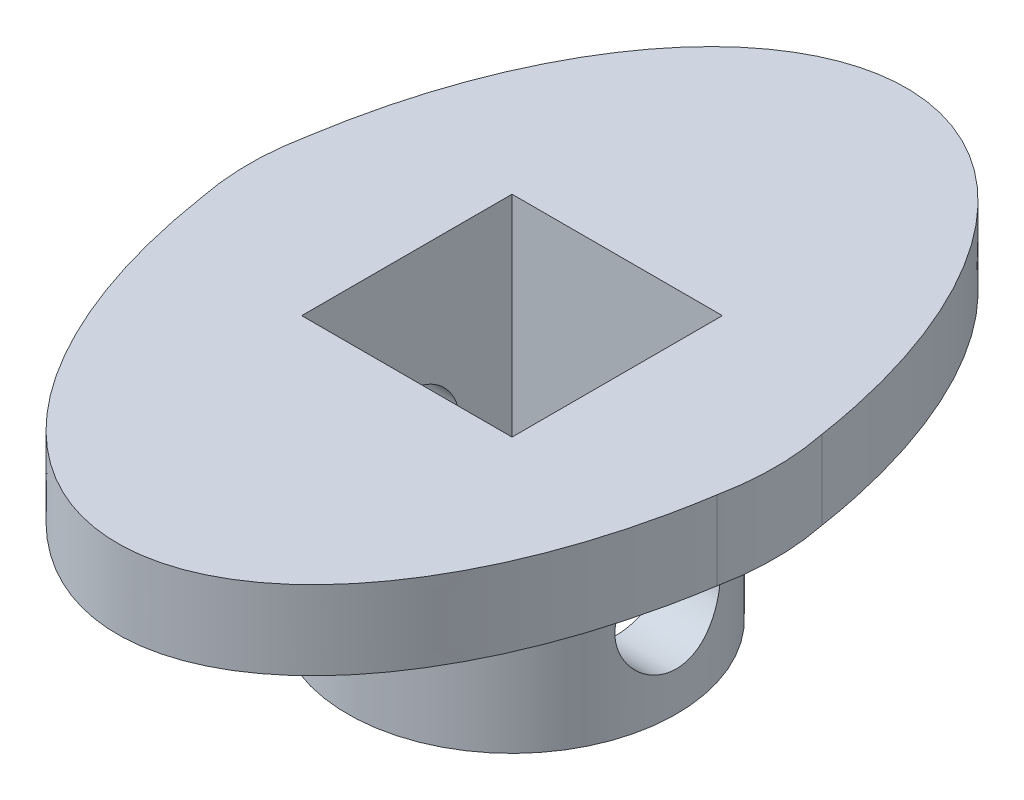
ISO-10303-21;
HEADER;
FILE_DESCRIPTION(('STEP AP214'),'2;1');
FILE_NAME('part.step','',(''),(''),'','','');
FILE_SCHEMA(('AUTOMOTIVE_DESIGN { 1 0 10303 214 1 1 1 1 }'));
ENDSEC;
DATA;
#1=APPLICATION_CONTEXT('core data for automotive mechanical design processes');
#2=APPLICATION_PROTOCOL_DEFINITION('international standard','automotive_design',2000,#1);
#3=PRODUCT_CONTEXT('',#1,'mechanical');
#4=PRODUCT('Part','Part','',(#3));
#5=PRODUCT_RELATED_PRODUCT_CATEGORY('part','',(#4));
#6=PRODUCT_DEFINITION_FORMATION('','',#4);
#7=PRODUCT_DEFINITION_CONTEXT('part definition',#1,'design');
#8=PRODUCT_DEFINITION('design','',#6,#7);
#9=PRODUCT_DEFINITION_SHAPE('','',#8);
#10=(LENGTH_UNIT() NAMED_UNIT(*) SI_UNIT(.MILLI.,.METRE.));
#11=(NAMED_UNIT(*) PLANE_ANGLE_UNIT() SI_UNIT($,.RADIAN.));
#12=(NAMED_UNIT(*) SI_UNIT($,.STERADIAN.) SOLID_ANGLE_UNIT());
#13=UNCERTAINTY_MEASURE_WITH_UNIT(LENGTH_MEASURE(1.E-05),#10,'distance_accuracy_value','');
#14=(GEOMETRIC_REPRESENTATION_CONTEXT(3) GLOBAL_UNCERTAINTY_ASSIGNED_CONTEXT((#13)) GLOBAL_UNIT_ASSIGNED_CONTEXT((#10,
#11,#12)) REPRESENTATION_CONTEXT('',''));
#15=CARTESIAN_POINT('',(0.,0.,0.));
#16=DIRECTION('',(0.,0.,1.));
#17=DIRECTION('',(1.,0.,0.));
#18=AXIS2_PLACEMENT_3D('',#15,#16,#17);
#19=CARTESIAN_POINT('',(0.,3.81,0.));
#20=DIRECTION('',(0.,-1.,0.));
#21=DIRECTION('',(0.,0.,-1.));
#22=AXIS2_PLACEMENT_3D('',#19,#20,#21);
#23=CYLINDRICAL_SURFACE('',#22,12.7);
#24=CARTESIAN_POINT('',(0.,0.,0.));
#25=DIRECTION('',(0.,1.,0.));
#26=DIRECTION('',(0.,0.,1.));
#27=AXIS2_PLACEMENT_3D('',#24,#25,#26);
#28=CIRCLE('',#27,12.7);
#29=CARTESIAN_POINT('',(12.4434078933385,0.,2.54));
#30=VERTEX_POINT('',#29);
#31=CARTESIAN_POINT('',(12.4434078933385,0.,-2.54));
#32=VERTEX_POINT('',#31);
#33=EDGE_CURVE('E150',#30,#32,#28,.T.);
#34=ORIENTED_EDGE('',*,*,#33,.T.);
#35=DIRECTION('',(0.,-1.,0.));
#36=VECTOR('',#35,1.);
#37=CARTESIAN_POINT('',(12.4434078933385,3.81,-2.54));
#38=LINE('',#37,#36);
#39=CARTESIAN_POINT('',(12.4434078933385,3.81,-2.54));
#40=VERTEX_POINT('',#39);
#41=EDGE_CURVE('E47',#40,#32,#38,.T.);
#42=ORIENTED_EDGE('',*,*,#41,.F.);
#43=CARTESIAN_POINT('',(0.,3.81,0.));
#44=DIRECTION('',(0.,1.,0.));
#45=DIRECTION('',(0.,0.,1.));
#46=AXIS2_PLACEMENT_3D('',#43,#44,#45);
#47=CIRCLE('',#46,12.7);
#48=CARTESIAN_POINT('',(12.4434078933385,3.81,2.54));
#49=VERTEX_POINT('',#48);
#50=EDGE_CURVE('E152',#49,#40,#47,.T.);
#51=ORIENTED_EDGE('',*,*,#50,.F.);
#52=DIRECTION('',(0.,-1.,0.));
#53=VECTOR('',#52,1.);
#54=CARTESIAN_POINT('',(12.4434078933385,3.81,2.54));
#55=LINE('',#54,#53);
#56=EDGE_CURVE('E169',#49,#30,#55,.T.);
#57=ORIENTED_EDGE('',*,*,#56,.T.);
#58=EDGE_LOOP('',(#34,#42,#51,#57));
#59=FACE_BOUND('',#58,.T.);
#60=ADVANCED_FACE('F37',(#59),#23,.T.);
#61=CARTESIAN_POINT('',(-12.4434078933385,3.81,-2.54));
#62=CARTESIAN_POINT('',(0.,3.81,-83.2069576125479));
#63=CARTESIAN_POINT('',(12.4434078933385,3.81,-2.54));
#64=(BOUNDED_CURVE() B_SPLINE_CURVE(2,(#61,#62,#63),.UNSPECIFIED.,.F.,
.F.) B_SPLINE_CURVE_WITH_KNOTS((3,3),(0.,1.),
.UNSPECIFIED.) CURVE() GEOMETRIC_REPRESENTATION_ITEM() RATIONAL_B_SPLINE_CURVE((1.,
0.257337639039962,1.)) REPRESENTATION_ITEM(''));
#65=DIRECTION('',(0.,-1.,0.));
#66=VECTOR('',#65,1.);
#67=SURFACE_OF_LINEAR_EXTRUSION('',#64,#66);
#68=CARTESIAN_POINT('',(-12.4434078933385,0.,-2.54));
#69=CARTESIAN_POINT('',(0.,0.,-83.2069576125479));
#70=CARTESIAN_POINT('',(12.4434078933385,0.,-2.54));
#71=(BOUNDED_CURVE() B_SPLINE_CURVE(2,(#68,#69,#70),.UNSPECIFIED.,.F.,
.F.) B_SPLINE_CURVE_WITH_KNOTS((3,3),(0.,1.),
.UNSPECIFIED.) CURVE() GEOMETRIC_REPRESENTATION_ITEM() RATIONAL_B_SPLINE_CURVE((1.,
0.257337639039962,1.)) REPRESENTATION_ITEM(''));
#72=CARTESIAN_POINT('',(-12.4434078933385,0.,-2.54));
#73=VERTEX_POINT('',#72);
#74=EDGE_CURVE('E202',#73,#32,#71,.T.);
#75=ORIENTED_EDGE('',*,*,#74,.F.);
#76=DIRECTION('',(0.,-1.,0.));
#77=VECTOR('',#76,1.);
#78=CARTESIAN_POINT('',(-12.4434078933385,3.81,-2.54));
#79=LINE('',#78,#77);
#80=CARTESIAN_POINT('',(-12.4434078933385,3.81,-2.54));
#81=VERTEX_POINT('',#80);
#82=EDGE_CURVE('E222',#81,#73,#79,.T.);
#83=ORIENTED_EDGE('',*,*,#82,.F.);
#84=EDGE_CURVE('E153',#81,#40,#64,.T.);
#85=ORIENTED_EDGE('',*,*,#84,.T.);
#86=ORIENTED_EDGE('',*,*,#41,.T.);
#87=EDGE_LOOP('',(#75,#83,#85,#86));
#88=FACE_BOUND('',#87,.T.);
#89=ADVANCED_FACE('F39',(#88),#67,.T.);
#90=CARTESIAN_POINT('',(-12.4434078933385,0.,2.54));
#91=VERTEX_POINT('',#90);
#92=EDGE_CURVE('E203',#73,#91,#28,.T.);
#93=ORIENTED_EDGE('',*,*,#92,.T.);
#94=DIRECTION('',(0.,-1.,0.));
#95=VECTOR('',#94,1.);
#96=CARTESIAN_POINT('',(-12.4434078933385,3.81,2.54));
#97=LINE('',#96,#95);
#98=CARTESIAN_POINT('',(-12.4434078933385,3.81,2.54));
#99=VERTEX_POINT('',#98);
#100=EDGE_CURVE('E219',#99,#91,#97,.T.);
#101=ORIENTED_EDGE('',*,*,#100,.F.);
#102=EDGE_CURVE('E155',#81,#99,#47,.T.);
#103=ORIENTED_EDGE('',*,*,#102,.F.);
#104=ORIENTED_EDGE('',*,*,#82,.T.);
#105=EDGE_LOOP('',(#93,#101,#103,#104));
#106=FACE_BOUND('',#105,.T.);
#107=ADVANCED_FACE('F179',(#106),#23,.T.);
#108=CARTESIAN_POINT('',(-12.4434078933385,3.81,2.54));
#109=CARTESIAN_POINT('',(0.,3.81,83.2069576125479));
#110=CARTESIAN_POINT('',(12.4434078933385,3.81,2.54));
#111=(BOUNDED_CURVE() B_SPLINE_CURVE(2,(#108,#109,#110),.UNSPECIFIED.,.F.,
.F.) B_SPLINE_CURVE_WITH_KNOTS((3,3),(0.,1.),
.UNSPECIFIED.) CURVE() GEOMETRIC_REPRESENTATION_ITEM() RATIONAL_B_SPLINE_CURVE((1.,
0.257337639039962,1.)) REPRESENTATION_ITEM(''));
#112=DIRECTION('',(0.,-1.,0.));
#113=VECTOR('',#112,1.);
#114=SURFACE_OF_LINEAR_EXTRUSION('',#111,#113);
#115=CARTESIAN_POINT('',(-12.4434078933385,0.,2.54));
#116=CARTESIAN_POINT('',(0.,0.,83.2069576125479));
#117=CARTESIAN_POINT('',(12.4434078933385,0.,2.54));
#118=(BOUNDED_CURVE() B_SPLINE_CURVE(2,(#115,#116,#117),.UNSPECIFIED.,.F.,
.F.) B_SPLINE_CURVE_WITH_KNOTS((3,3),(0.,1.),
.UNSPECIFIED.) CURVE() GEOMETRIC_REPRESENTATION_ITEM() RATIONAL_B_SPLINE_CURVE((1.,
0.257337639039962,1.)) REPRESENTATION_ITEM(''));
#119=EDGE_CURVE('E154',#91,#30,#118,.T.);
#120=ORIENTED_EDGE('',*,*,#119,.T.);
#121=ORIENTED_EDGE('',*,*,#56,.F.);
#122=EDGE_CURVE('E161',#99,#49,#111,.T.);
#123=ORIENTED_EDGE('',*,*,#122,.F.);
#124=ORIENTED_EDGE('',*,*,#100,.T.);
#125=EDGE_LOOP('',(#120,#121,#123,#124));
#126=FACE_BOUND('',#125,.T.);
#127=ADVANCED_FACE('F175',(#126),#114,.F.);
#128=CARTESIAN_POINT('',(0.,3.81,0.));
#129=DIRECTION('',(0.,1.,0.));
#130=DIRECTION('',(0.,0.,1.));
#131=AXIS2_PLACEMENT_3D('',#128,#129,#130);
#132=PLANE('',#131);
#133=DIRECTION('',(0.,0.,-1.));
#134=VECTOR('',#133,1.);
#135=CARTESIAN_POINT('',(5.08,3.81,-5.08));
#136=LINE('',#135,#134);
#137=CARTESIAN_POINT('',(5.08,3.81,5.08));
#138=VERTEX_POINT('',#137);
#139=CARTESIAN_POINT('',(5.08,3.81,-5.08));
#140=VERTEX_POINT('',#139);
#141=EDGE_CURVE('E55',#138,#140,#136,.T.);
#142=ORIENTED_EDGE('',*,*,#141,.F.);
#143=DIRECTION('',(1.,0.,0.));
#144=VECTOR('',#143,1.);
#145=CARTESIAN_POINT('',(-5.08,3.81,5.08));
#146=LINE('',#145,#144);
#147=CARTESIAN_POINT('',(-5.08,3.81,5.08));
#148=VERTEX_POINT('',#147);
#149=EDGE_CURVE('E123',#148,#138,#146,.T.);
#150=ORIENTED_EDGE('',*,*,#149,.F.);
#151=DIRECTION('',(0.,0.,1.));
#152=VECTOR('',#151,1.);
#153=CARTESIAN_POINT('',(-5.08,3.81,-5.08));
#154=LINE('',#153,#152);
#155=CARTESIAN_POINT('',(-5.08,3.81,-5.08));
#156=VERTEX_POINT('',#155);
#157=EDGE_CURVE('E126',#156,#148,#154,.T.);
#158=ORIENTED_EDGE('',*,*,#157,.F.);
#159=DIRECTION('',(-1.,0.,0.));
#160=VECTOR('',#159,1.);
#161=CARTESIAN_POINT('',(-5.08,3.81,-5.08));
#162=LINE('',#161,#160);
#163=EDGE_CURVE('E139',#140,#156,#162,.T.);
#164=ORIENTED_EDGE('',*,*,#163,.F.);
#165=EDGE_LOOP('',(#142,#150,#158,#164));
#166=FACE_BOUND('',#165,.T.);
#167=ORIENTED_EDGE('',*,*,#50,.T.);
#168=ORIENTED_EDGE('',*,*,#84,.F.);
#169=ORIENTED_EDGE('',*,*,#102,.T.);
#170=ORIENTED_EDGE('',*,*,#122,.T.);
#171=EDGE_LOOP('',(#167,#168,#169,#170));
#172=FACE_BOUND('',#171,.T.);
#173=ADVANCED_FACE('F178',(#166,#172),#132,.T.);
#174=CARTESIAN_POINT('',(0.,0.,0.));
#175=DIRECTION('',(0.,1.,0.));
#176=DIRECTION('',(0.,0.,1.));
#177=AXIS2_PLACEMENT_3D('',#174,#175,#176);
#178=PLANE('',#177);
#179=CARTESIAN_POINT('',(0.,0.,0.));
#180=DIRECTION('',(0.,-1.,0.));
#181=DIRECTION('',(0.,0.,-1.));
#182=AXIS2_PLACEMENT_3D('',#179,#180,#181);
#183=CIRCLE('',#182,7.9375);
#184=CARTESIAN_POINT('',(0.,0.,-7.9375));
#185=VERTEX_POINT('',#184);
#186=EDGE_CURVE('E11',#185,#185,#183,.T.);
#187=ORIENTED_EDGE('',*,*,#186,.F.);
#188=EDGE_LOOP('',(#187));
#189=FACE_BOUND('',#188,.T.);
#190=ORIENTED_EDGE('',*,*,#33,.F.);
#191=ORIENTED_EDGE('',*,*,#119,.F.);
#192=ORIENTED_EDGE('',*,*,#92,.F.);
#193=ORIENTED_EDGE('',*,*,#74,.T.);
#194=EDGE_LOOP('',(#190,#191,#192,#193));
#195=FACE_BOUND('',#194,.T.);
#196=ADVANCED_FACE('F181',(#189,#195),#178,.F.);
#197=CARTESIAN_POINT('',(0.,-8.89,0.));
#198=DIRECTION('',(0.,1.,0.));
#199=DIRECTION('',(0.,0.,1.));
#200=AXIS2_PLACEMENT_3D('',#197,#198,#199);
#201=CYLINDRICAL_SURFACE('',#200,7.9375);
#202=CARTESIAN_POINT('',(-7.51674173096296,-4.445,-2.55));
#203=CARTESIAN_POINT('',(-7.51674209301751,-4.30579210962964,-2.54999968579276));
#204=CARTESIAN_POINT('',(-7.52065116153256,-4.16658020535011,-2.53856204321299));
#205=CARTESIAN_POINT('',(-7.53579100506697,-3.89226052787601,-2.49325415745681));
#206=CARTESIAN_POINT('',(-7.54702343184496,-3.75715368776144,-2.45937885351454));
#207=CARTESIAN_POINT('',(-7.57540929670817,-3.49505921149254,-2.3704921025115));
#208=CARTESIAN_POINT('',(-7.59255178991807,-3.36805707784317,-2.31551970409571));
#209=CARTESIAN_POINT('',(-7.63081076325657,-3.12504024741539,-2.18613083452611));
#210=CARTESIAN_POINT('',(-7.65192801946053,-3.00902770302336,-2.1117105650574));
#211=CARTESIAN_POINT('',(-7.69661732704755,-2.78706978084677,-1.94264358496904));
#212=CARTESIAN_POINT('',(-7.72024733603021,-2.68158205725556,-1.84741122354521));
#213=CARTESIAN_POINT('',(-7.76680784873429,-2.48776567451859,-1.6406751716031));
#214=CARTESIAN_POINT('',(-7.78973824847056,-2.39943955578415,-1.52916907637553));
#215=CARTESIAN_POINT('',(-7.83298220799389,-2.24041062509327,-1.28973811233821));
#216=CARTESIAN_POINT('',(-7.85321960801438,-2.17018251689354,-1.16148298108182));
#217=CARTESIAN_POINT('',(-7.8881180487891,-2.05247496175666,-0.894219768711328));
#218=CARTESIAN_POINT('',(-7.90278047899172,-2.00498984582188,-0.755214377288887));
#219=CARTESIAN_POINT('',(-7.92446656999499,-1.93565412743984,-0.475191100370484));
#220=CARTESIAN_POINT('',(-7.93172299871796,-1.9130205759543,-0.334385437293964));
#221=CARTESIAN_POINT('',(-7.9386032983381,-1.89154613168168,-0.0508005360352898));
#222=CARTESIAN_POINT('',(-7.93822899999219,-1.89269953195204,0.0919782205493903));
#223=CARTESIAN_POINT('',(-7.93005030467948,-1.91825880827996,0.369932941166455));
#224=CARTESIAN_POINT('',(-7.92251734076976,-1.9418152591254,0.505196289858465));
#225=CARTESIAN_POINT('',(-7.90120443152868,-2.01011368788663,0.769736757917166));
#226=CARTESIAN_POINT('',(-7.88742407151225,-2.05485707214186,0.899013479280009));
#227=CARTESIAN_POINT('',(-7.85480814776232,-2.16478422465111,1.14982830643781));
#228=CARTESIAN_POINT('',(-7.83591091982689,-2.23021907989978,1.27124801620895));
#229=CARTESIAN_POINT('',(-7.79504243917207,-2.37946809223398,1.50164255165648));
#230=CARTESIAN_POINT('',(-7.77307037660628,-2.46328709462505,1.61061408496859));
#231=CARTESIAN_POINT('',(-7.72724275439684,-2.65125316951063,1.81807949493216));
#232=CARTESIAN_POINT('',(-7.70334685490187,-2.75613135841926,1.91590300344405));
#233=CARTESIAN_POINT('',(-7.65718964854944,-2.98101966515171,2.09278048772917));
#234=CARTESIAN_POINT('',(-7.6349285579929,-3.10103177965202,2.17183198286414));
#235=CARTESIAN_POINT('',(-7.59435064212822,-3.35476988001274,2.30976163804985));
#236=CARTESIAN_POINT('',(-7.57608618136251,-3.48864754310625,2.36837733238579));
#237=CARTESIAN_POINT('',(-7.54617999665768,-3.76510388308435,2.46201505525728));
#238=CARTESIAN_POINT('',(-7.53453573173849,-3.9076791983161,2.49704613704972));
#239=CARTESIAN_POINT('',(-7.51975690709242,-4.19103123365471,2.54119748935856));
#240=CARTESIAN_POINT('',(-7.51628369736032,-4.3316295737598,2.55134965615878));
#241=CARTESIAN_POINT('',(-7.51729734078425,-4.61253530233954,2.54836270519364));
#242=CARTESIAN_POINT('',(-7.52178287696679,-4.75284273510579,2.53522744091622));
#243=CARTESIAN_POINT('',(-7.5378728897132,-5.02463857576824,2.48696283790277));
#244=CARTESIAN_POINT('',(-7.54925150462393,-5.15626555008862,2.45253060225557));
#245=CARTESIAN_POINT('',(-7.57760249059841,-5.41185446270977,2.36347533891299));
#246=CARTESIAN_POINT('',(-7.59457580755186,-5.5358151006603,2.30884889681692));
#247=CARTESIAN_POINT('',(-7.63283443414143,-5.77666527712776,2.17909108354803));
#248=CARTESIAN_POINT('',(-7.65423370378982,-5.89323166308793,2.10339437570674));
#249=CARTESIAN_POINT('',(-7.69870333373891,-6.11238235185131,1.9342967114485));
#250=CARTESIAN_POINT('',(-7.72177415146282,-6.21496280506986,1.84089089749933));
#251=CARTESIAN_POINT('',(-7.76822033268718,-6.40790763930158,1.63412204612176));
#252=CARTESIAN_POINT('',(-7.79156413537835,-6.49753228237388,1.5200597204476));
#253=CARTESIAN_POINT('',(-7.8349131696018,-6.6564057987775,1.27794529038674));
#254=CARTESIAN_POINT('',(-7.85491854170069,-6.72565553010034,1.14989377539903));
#255=CARTESIAN_POINT('',(-7.88923000612684,-6.8411583938043,0.884169325882752));
#256=CARTESIAN_POINT('',(-7.90357578167203,-6.88757223315062,0.746571637934226));
#257=CARTESIAN_POINT('',(-7.92512517772522,-6.95643110233705,0.464977355176636));
#258=CARTESIAN_POINT('',(-7.9323311737505,-6.97888410451742,0.320982905342763));
#259=CARTESIAN_POINT('',(-7.93862258126842,-6.99850706005603,0.0374736192383458));
#260=CARTESIAN_POINT('',(-7.93805028819617,-6.99674270013995,-0.101960703042515));
#261=CARTESIAN_POINT('',(-7.92967877804374,-6.9705794995258,-0.378455034848383));
#262=CARTESIAN_POINT('',(-7.92188007853961,-6.94618227985816,-0.515515213700195));
#263=CARTESIAN_POINT('',(-7.90004764621,-6.8761368987062,-0.781493252123599));
#264=CARTESIAN_POINT('',(-7.88610182456865,-6.83078794666021,-0.910497632002165));
#265=CARTESIAN_POINT('',(-7.8534118471597,-6.72039920006632,-1.15912416589867));
#266=CARTESIAN_POINT('',(-7.8346668476009,-6.65535594249898,-1.27874466520664));
#267=CARTESIAN_POINT('',(-7.79350267185574,-6.50478024770454,-1.50979612636066));
#268=CARTESIAN_POINT('',(-7.770977337189,-6.41860682257915,-1.62079022598319));
#269=CARTESIAN_POINT('',(-7.72507761189746,-6.2293306406026,-1.82709405692553));
#270=CARTESIAN_POINT('',(-7.70170296198159,-6.12622267933541,-1.92239894846452));
#271=CARTESIAN_POINT('',(-7.65575799721101,-5.90161023031585,-2.0980524038358));
#272=CARTESIAN_POINT('',(-7.6332459144693,-5.77958161898148,-2.17774796854284));
#273=CARTESIAN_POINT('',(-7.59262089647812,-5.52317513354885,-2.31542517126984));
#274=CARTESIAN_POINT('',(-7.57450643582501,-5.38880156390527,-2.37341434238175));
#275=CARTESIAN_POINT('',(-7.54598517887524,-5.12099245495335,-2.46253106784439));
#276=CARTESIAN_POINT('',(-7.53513416099887,-4.98812734537027,-2.49523104727762));
#277=CARTESIAN_POINT('',(-7.52051326526789,-4.71850870436572,-2.53896258909674));
#278=CARTESIAN_POINT('',(-7.51674137528458,-4.58175628907062,-2.55000030867371));
#279=CARTESIAN_POINT('',(-7.51674173096296,-4.445,-2.55));
#280=B_SPLINE_CURVE_WITH_KNOTS('',3,(#202,#203,#204,#205,#206,#207,#208,#209,#210,#211,#212,
#213,#214,#215,#216,#217,#218,#219,#220,#221,#222,#223,#224,#225,#226,#227,#228,#229,#230,#231,
#232,#233,#234,#235,#236,#237,#238,#239,#240,#241,#242,#243,#244,#245,#246,#247,#248,#249,#250,
#251,#252,#253,#254,#255,#256,#257,#258,#259,#260,#261,#262,#263,#264,#265,#266,#267,#268,#269,
#270,#271,#272,#273,#274,#275,#276,#277,#278,#279),.UNSPECIFIED.,.T.,.F.,(4,2,2,2,2,2,2,2,2,2,2,
2,2,2,2,2,2,2,2,2,2,2,2,2,2,2,2,2,2,2,2,2,2,2,2,2,2,2,4),(0.,0.417117983193688,
0.834330078494504,1.25077365083331,1.66729861858781,2.09754775349061,2.52786052920338,
2.96851790382221,3.40906538140707,3.83529538827929,4.26142313564881,4.67201231711839,
5.08262875636548,5.49843260539062,5.91434617518897,6.34852639997691,6.78276396786585,
7.2223892480156,7.66184567598087,8.08274086814302,8.50356641916851,8.91129723335814,
9.31909701750612,9.73911547183145,10.1592493025442,10.5979408533963,11.0366139282165,
11.4721540486288,11.9075492092611,12.3238485911303,12.740118158744,13.1506185208242,
13.5611911066799,13.9862251377597,14.4113900379322,14.8516862765046,15.291829570556,
15.7017181774848,16.1114902624897),.UNSPECIFIED.);
#281=CARTESIAN_POINT('',(-7.51674173096296,-4.445,-2.55));
#282=VERTEX_POINT('',#281);
#283=EDGE_CURVE('E129',#282,#282,#280,.T.);
#284=ORIENTED_EDGE('',*,*,#283,.T.);
#285=EDGE_LOOP('',(#284));
#286=FACE_BOUND('',#285,.T.);
#287=CARTESIAN_POINT('',(7.51674173096296,-4.445,-2.55));
#288=CARTESIAN_POINT('',(7.51674209301751,-4.58420789037036,-2.54999968579276));
#289=CARTESIAN_POINT('',(7.52065116153255,-4.72341979464989,-2.538562043213));
#290=CARTESIAN_POINT('',(7.53579100506697,-4.99773947212399,-2.49325415745681));
#291=CARTESIAN_POINT('',(7.54702343184496,-5.13284631223855,-2.45937885351455));
#292=CARTESIAN_POINT('',(7.57540929670817,-5.39494078850746,-2.37049210251151));
#293=CARTESIAN_POINT('',(7.59255178991807,-5.52194292215683,-2.31551970409571));
#294=CARTESIAN_POINT('',(7.63081076325657,-5.7649597525846,-2.18613083452611));
#295=CARTESIAN_POINT('',(7.65192801946053,-5.88097229697664,-2.11171056505741));
#296=CARTESIAN_POINT('',(7.69661732704755,-6.10293021915323,-1.94264358496904));
#297=CARTESIAN_POINT('',(7.72024733603021,-6.20841794274444,-1.84741122354521));
#298=CARTESIAN_POINT('',(7.76680784873429,-6.40223432548141,-1.6406751716031));
#299=CARTESIAN_POINT('',(7.78973824847056,-6.49056044421585,-1.52916907637553));
#300=CARTESIAN_POINT('',(7.83298220799389,-6.64958937490673,-1.28973811233821));
#301=CARTESIAN_POINT('',(7.85321960801438,-6.71981748310646,-1.16148298108182));
#302=CARTESIAN_POINT('',(7.8881180487891,-6.83752503824334,-0.89421976871133));
#303=CARTESIAN_POINT('',(7.90278047899172,-6.88501015417812,-0.755214377288888));
#304=CARTESIAN_POINT('',(7.92446656999499,-6.95434587256016,-0.475191100370486));
#305=CARTESIAN_POINT('',(7.93172299871796,-6.9769794240457,-0.334385437293966));
#306=CARTESIAN_POINT('',(7.9386032983381,-6.99845386831832,-0.0508005360352915));
#307=CARTESIAN_POINT('',(7.93822899999219,-6.99730046804795,0.0919782205493885));
#308=CARTESIAN_POINT('',(7.93005030467948,-6.97174119172003,0.369932941166453));
#309=CARTESIAN_POINT('',(7.92251734076976,-6.9481847408746,0.505196289858463));
#310=CARTESIAN_POINT('',(7.90120443152868,-6.87988631211337,0.769736757917164));
#311=CARTESIAN_POINT('',(7.88742407151225,-6.83514292785813,0.899013479280007));
#312=CARTESIAN_POINT('',(7.85480814776232,-6.72521577534889,1.14982830643781));
#313=CARTESIAN_POINT('',(7.83591091982689,-6.65978092010022,1.27124801620895));
#314=CARTESIAN_POINT('',(7.79504243917207,-6.51053190776602,1.50164255165647));
#315=CARTESIAN_POINT('',(7.77307037660628,-6.42671290537495,1.61061408496859));
#316=CARTESIAN_POINT('',(7.72724275439684,-6.23874683048937,1.81807949493216));
#317=CARTESIAN_POINT('',(7.70334685490187,-6.13386864158074,1.91590300344405));
#318=CARTESIAN_POINT('',(7.65718964854944,-5.90898033484828,2.09278048772916));
#319=CARTESIAN_POINT('',(7.6349285579929,-5.78896822034798,2.17183198286414));
#320=CARTESIAN_POINT('',(7.59435064212822,-5.53523011998726,2.30976163804985));
#321=CARTESIAN_POINT('',(7.57608618136251,-5.40135245689375,2.36837733238579));
#322=CARTESIAN_POINT('',(7.54617999665768,-5.12489611691565,2.46201505525728));
#323=CARTESIAN_POINT('',(7.53453573173849,-4.9823208016839,2.49704613704972));
#324=CARTESIAN_POINT('',(7.51975690709242,-4.69896876634529,2.54119748935856));
#325=CARTESIAN_POINT('',(7.51628369736032,-4.5583704262402,2.55134965615878));
#326=CARTESIAN_POINT('',(7.51729734078425,-4.27746469766046,2.54836270519364));
#327=CARTESIAN_POINT('',(7.52178287696679,-4.13715726489421,2.53522744091622));
#328=CARTESIAN_POINT('',(7.5378728897132,-3.86536142423177,2.48696283790277));
#329=CARTESIAN_POINT('',(7.54925150462393,-3.73373444991138,2.45253060225557));
#330=CARTESIAN_POINT('',(7.57760249059841,-3.47814553729023,2.36347533891299));
#331=CARTESIAN_POINT('',(7.59457580755186,-3.3541848993397,2.30884889681692));
#332=CARTESIAN_POINT('',(7.63283443414143,-3.11333472287224,2.17909108354803));
#333=CARTESIAN_POINT('',(7.65423370378983,-2.99676833691207,2.10339437570674));
#334=CARTESIAN_POINT('',(7.69870333373891,-2.77761764814869,1.9342967114485));
#335=CARTESIAN_POINT('',(7.72177415146282,-2.67503719493014,1.84089089749933));
#336=CARTESIAN_POINT('',(7.76822033268718,-2.48209236069842,1.63412204612176));
#337=CARTESIAN_POINT('',(7.79156413537835,-2.39246771762611,1.5200597204476));
#338=CARTESIAN_POINT('',(7.8349131696018,-2.23359420122249,1.27794529038674));
#339=CARTESIAN_POINT('',(7.85491854170069,-2.16434446989966,1.14989377539903));
#340=CARTESIAN_POINT('',(7.88923000612684,-2.04884160619569,0.884169325882752));
#341=CARTESIAN_POINT('',(7.90357578167203,-2.00242776684938,0.746571637934225));
#342=CARTESIAN_POINT('',(7.92512517772522,-1.93356889766295,0.464977355176635));
#343=CARTESIAN_POINT('',(7.9323311737505,-1.91111589548257,0.320982905342763));
#344=CARTESIAN_POINT('',(7.93862258126842,-1.89149293994397,0.0374736192383468));
#345=CARTESIAN_POINT('',(7.93805028819616,-1.89325729986005,-0.101960703042514));
#346=CARTESIAN_POINT('',(7.92967877804374,-1.9194205004742,-0.378455034848382));
#347=CARTESIAN_POINT('',(7.92188007853961,-1.94381772014184,-0.515515213700195));
#348=CARTESIAN_POINT('',(7.90004764621001,-2.0138631012938,-0.781493252123597));
#349=CARTESIAN_POINT('',(7.88610182456865,-2.05921205333979,-0.910497632002163));
#350=CARTESIAN_POINT('',(7.8534118471597,-2.16960079993368,-1.15912416589867));
#351=CARTESIAN_POINT('',(7.8346668476009,-2.23464405750102,-1.27874466520663));
#352=CARTESIAN_POINT('',(7.79350267185574,-2.38521975229545,-1.50979612636066));
#353=CARTESIAN_POINT('',(7.770977337189,-2.47139317742084,-1.62079022598319));
#354=CARTESIAN_POINT('',(7.72507761189746,-2.66066935939739,-1.82709405692553));
#355=CARTESIAN_POINT('',(7.70170296198159,-2.76377732066459,-1.92239894846452));
#356=CARTESIAN_POINT('',(7.65575799721101,-2.98838976968415,-2.0980524038358));
#357=CARTESIAN_POINT('',(7.6332459144693,-3.11041838101852,-2.17774796854284));
#358=CARTESIAN_POINT('',(7.59262089647812,-3.36682486645115,-2.31542517126984));
#359=CARTESIAN_POINT('',(7.57450643582501,-3.50119843609473,-2.37341434238175));
#360=CARTESIAN_POINT('',(7.54598517887523,-3.76900754504665,-2.46253106784439));
#361=CARTESIAN_POINT('',(7.53513416099887,-3.90187265462973,-2.49523104727762));
#362=CARTESIAN_POINT('',(7.52051326526789,-4.17149129563428,-2.53896258909675));
#363=CARTESIAN_POINT('',(7.51674137528458,-4.30824371092937,-2.55000030867371));
#364=CARTESIAN_POINT('',(7.51674173096296,-4.445,-2.55));
#365=B_SPLINE_CURVE_WITH_KNOTS('',3,(#287,#288,#289,#290,#291,#292,#293,#294,#295,#296,#297,
#298,#299,#300,#301,#302,#303,#304,#305,#306,#307,#308,#309,#310,#311,#312,#313,#314,#315,#316,
#317,#318,#319,#320,#321,#322,#323,#324,#325,#326,#327,#328,#329,#330,#331,#332,#333,#334,#335,
#336,#337,#338,#339,#340,#341,#342,#343,#344,#345,#346,#347,#348,#349,#350,#351,#352,#353,#354,
#355,#356,#357,#358,#359,#360,#361,#362,#363,#364),.UNSPECIFIED.,.T.,.F.,(4,2,2,2,2,2,2,2,2,2,2,
2,2,2,2,2,2,2,2,2,2,2,2,2,2,2,2,2,2,2,2,2,2,2,2,2,2,2,4),(0.,0.417117983193688,
0.834330078494504,1.25077365083331,1.66729861858781,2.09754775349061,2.52786052920338,
2.96851790382221,3.40906538140707,3.83529538827929,4.26142313564881,4.67201231711839,
5.08262875636548,5.49843260539062,5.91434617518897,6.34852639997691,6.78276396786585,
7.22238924801559,7.66184567598087,8.08274086814302,8.50356641916851,8.91129723335813,
9.31909701750611,9.73911547183145,10.1592493025442,10.5979408533963,11.0366139282165,
11.4721540486287,11.9075492092611,12.3238485911303,12.740118158744,13.1506185208242,
13.5611911066799,13.9862251377597,14.4113900379322,14.8516862765046,15.291829570556,
15.7017181774848,16.1114902624897),.UNSPECIFIED.);
#366=CARTESIAN_POINT('',(7.51674173096296,-4.445,-2.55));
#367=VERTEX_POINT('',#366);
#368=EDGE_CURVE('E241',#367,#367,#365,.T.);
#369=ORIENTED_EDGE('',*,*,#368,.T.);
#370=EDGE_LOOP('',(#369));
#371=FACE_BOUND('',#370,.T.);
#372=CARTESIAN_POINT('',(0.,-8.89,0.));
#373=DIRECTION('',(0.,-1.,0.));
#374=DIRECTION('',(0.,0.,-1.));
#375=AXIS2_PLACEMENT_3D('',#372,#373,#374);
#376=CIRCLE('',#375,7.9375);
#377=CARTESIAN_POINT('',(0.,-8.89,-7.9375));
#378=VERTEX_POINT('',#377);
#379=EDGE_CURVE('E145',#378,#378,#376,.T.);
#380=ORIENTED_EDGE('',*,*,#379,.F.);
#381=EDGE_LOOP('',(#380));
#382=FACE_BOUND('',#381,.T.);
#383=ORIENTED_EDGE('',*,*,#186,.T.);
#384=EDGE_LOOP('',(#383));
#385=FACE_BOUND('',#384,.T.);
#386=ADVANCED_FACE('F233',(#286,#371,#382,#385),#201,.T.);
#387=CARTESIAN_POINT('',(0.,-8.89,0.));
#388=DIRECTION('',(0.,-1.,0.));
#389=DIRECTION('',(0.,0.,-1.));
#390=AXIS2_PLACEMENT_3D('',#387,#388,#389);
#391=PLANE('',#390);
#392=DIRECTION('',(0.,0.,-1.));
#393=VECTOR('',#392,1.);
#394=CARTESIAN_POINT('',(5.08,-8.89,-5.08));
#395=LINE('',#394,#393);
#396=CARTESIAN_POINT('',(5.08,-8.89,5.08));
#397=VERTEX_POINT('',#396);
#398=CARTESIAN_POINT('',(5.08,-8.89,-5.08));
#399=VERTEX_POINT('',#398);
#400=EDGE_CURVE('E107',#397,#399,#395,.T.);
#401=ORIENTED_EDGE('',*,*,#400,.T.);
#402=DIRECTION('',(-1.,0.,0.));
#403=VECTOR('',#402,1.);
#404=CARTESIAN_POINT('',(-5.08,-8.89,-5.08));
#405=LINE('',#404,#403);
#406=CARTESIAN_POINT('',(-5.08,-8.89,-5.08));
#407=VERTEX_POINT('',#406);
#408=EDGE_CURVE('E116',#399,#407,#405,.T.);
#409=ORIENTED_EDGE('',*,*,#408,.T.);
#410=DIRECTION('',(0.,0.,1.));
#411=VECTOR('',#410,1.);
#412=CARTESIAN_POINT('',(-5.08,-8.89,-5.08));
#413=LINE('',#412,#411);
#414=CARTESIAN_POINT('',(-5.08,-8.89,5.08));
#415=VERTEX_POINT('',#414);
#416=EDGE_CURVE('E63',#407,#415,#413,.T.);
#417=ORIENTED_EDGE('',*,*,#416,.T.);
#418=DIRECTION('',(1.,0.,0.));
#419=VECTOR('',#418,1.);
#420=CARTESIAN_POINT('',(-5.08,-8.89,5.08));
#421=LINE('',#420,#419);
#422=EDGE_CURVE('E113',#415,#397,#421,.T.);
#423=ORIENTED_EDGE('',*,*,#422,.T.);
#424=EDGE_LOOP('',(#401,#409,#417,#423));
#425=FACE_BOUND('',#424,.T.);
#426=ORIENTED_EDGE('',*,*,#379,.T.);
#427=EDGE_LOOP('',(#426));
#428=FACE_BOUND('',#427,.T.);
#429=ADVANCED_FACE('F120',(#425,#428),#391,.T.);
#430=CARTESIAN_POINT('',(5.08,-8.89,-5.08));
#431=DIRECTION('',(1.,0.,0.));
#432=DIRECTION('',(0.,0.,-1.));
#433=AXIS2_PLACEMENT_3D('',#430,#431,#432);
#434=PLANE('',#433);
#435=CARTESIAN_POINT('',(5.08,-4.445,0.));
#436=DIRECTION('',(1.,0.,0.));
#437=DIRECTION('',(0.,0.,-1.));
#438=AXIS2_PLACEMENT_3D('',#435,#436,#437);
#439=CIRCLE('',#438,2.55);
#440=CARTESIAN_POINT('',(5.08,-4.445,-2.55));
#441=VERTEX_POINT('',#440);
#442=EDGE_CURVE('E246',#441,#441,#439,.T.);
#443=ORIENTED_EDGE('',*,*,#442,.T.);
#444=EDGE_LOOP('',(#443));
#445=FACE_BOUND('',#444,.T.);
#446=ORIENTED_EDGE('',*,*,#141,.T.);
#447=DIRECTION('',(0.,1.,0.));
#448=VECTOR('',#447,1.);
#449=CARTESIAN_POINT('',(5.08,-8.89,-5.08));
#450=LINE('',#449,#448);
#451=EDGE_CURVE('E103',#399,#140,#450,.T.);
#452=ORIENTED_EDGE('',*,*,#451,.F.);
#453=ORIENTED_EDGE('',*,*,#400,.F.);
#454=DIRECTION('',(0.,1.,0.));
#455=VECTOR('',#454,1.);
#456=CARTESIAN_POINT('',(5.08,-8.89,5.08));
#457=LINE('',#456,#455);
#458=EDGE_CURVE('E143',#397,#138,#457,.T.);
#459=ORIENTED_EDGE('',*,*,#458,.T.);
#460=EDGE_LOOP('',(#446,#452,#453,#459));
#461=FACE_BOUND('',#460,.T.);
#462=ADVANCED_FACE('F105',(#445,#461),#434,.F.);
#463=CARTESIAN_POINT('',(-5.08,-8.89,5.08));
#464=DIRECTION('',(0.,0.,1.));
#465=DIRECTION('',(1.,0.,0.));
#466=AXIS2_PLACEMENT_3D('',#463,#464,#465);
#467=PLANE('',#466);
#468=ORIENTED_EDGE('',*,*,#149,.T.);
#469=ORIENTED_EDGE('',*,*,#458,.F.);
#470=ORIENTED_EDGE('',*,*,#422,.F.);
#471=DIRECTION('',(0.,1.,0.));
#472=VECTOR('',#471,1.);
#473=CARTESIAN_POINT('',(-5.08,-8.89,5.08));
#474=LINE('',#473,#472);
#475=EDGE_CURVE('E146',#415,#148,#474,.T.);
#476=ORIENTED_EDGE('',*,*,#475,.T.);
#477=EDGE_LOOP('',(#468,#469,#470,#476));
#478=FACE_BOUND('',#477,.T.);
#479=ADVANCED_FACE('F253',(#478),#467,.F.);
#480=CARTESIAN_POINT('',(-5.08,-8.89,-5.08));
#481=DIRECTION('',(-1.,0.,0.));
#482=DIRECTION('',(0.,0.,1.));
#483=AXIS2_PLACEMENT_3D('',#480,#481,#482);
#484=PLANE('',#483);
#485=CARTESIAN_POINT('',(-5.08,-4.445,0.));
#486=DIRECTION('',(-1.,0.,0.));
#487=DIRECTION('',(0.,0.,1.));
#488=AXIS2_PLACEMENT_3D('',#485,#486,#487);
#489=CIRCLE('',#488,2.55);
#490=CARTESIAN_POINT('',(-5.08,-4.445,2.55));
#491=VERTEX_POINT('',#490);
#492=EDGE_CURVE('E42',#491,#491,#489,.T.);
#493=ORIENTED_EDGE('',*,*,#492,.T.);
#494=EDGE_LOOP('',(#493));
#495=FACE_BOUND('',#494,.T.);
#496=ORIENTED_EDGE('',*,*,#157,.T.);
#497=ORIENTED_EDGE('',*,*,#475,.F.);
#498=ORIENTED_EDGE('',*,*,#416,.F.);
#499=DIRECTION('',(0.,1.,0.));
#500=VECTOR('',#499,1.);
#501=CARTESIAN_POINT('',(-5.08,-8.89,-5.08));
#502=LINE('',#501,#500);
#503=EDGE_CURVE('E112',#407,#156,#502,.T.);
#504=ORIENTED_EDGE('',*,*,#503,.T.);
#505=EDGE_LOOP('',(#496,#497,#498,#504));
#506=FACE_BOUND('',#505,.T.);
#507=ADVANCED_FACE('F257',(#495,#506),#484,.F.);
#508=CARTESIAN_POINT('',(-5.08,-8.89,-5.08));
#509=DIRECTION('',(0.,0.,-1.));
#510=DIRECTION('',(-1.,0.,0.));
#511=AXIS2_PLACEMENT_3D('',#508,#509,#510);
#512=PLANE('',#511);
#513=ORIENTED_EDGE('',*,*,#163,.T.);
#514=ORIENTED_EDGE('',*,*,#503,.F.);
#515=ORIENTED_EDGE('',*,*,#408,.F.);
#516=ORIENTED_EDGE('',*,*,#451,.T.);
#517=EDGE_LOOP('',(#513,#514,#515,#516));
#518=FACE_BOUND('',#517,.T.);
#519=ADVANCED_FACE('F117',(#518),#512,.F.);
#520=CARTESIAN_POINT('',(-12.7,-4.445,0.));
#521=DIRECTION('',(1.,0.,0.));
#522=DIRECTION('',(0.,0.,-1.));
#523=AXIS2_PLACEMENT_3D('',#520,#521,#522);
#524=CYLINDRICAL_SURFACE('',#523,2.55);
#525=ORIENTED_EDGE('',*,*,#492,.F.);
#526=EDGE_LOOP('',(#525));
#527=FACE_BOUND('',#526,.T.);
#528=ORIENTED_EDGE('',*,*,#283,.F.);
#529=EDGE_LOOP('',(#528));
#530=FACE_BOUND('',#529,.T.);
#531=ADVANCED_FACE('F247',(#527,#530),#524,.F.);
#532=ORIENTED_EDGE('',*,*,#442,.F.);
#533=EDGE_LOOP('',(#532));
#534=FACE_BOUND('',#533,.T.);
#535=ORIENTED_EDGE('',*,*,#368,.F.);
#536=EDGE_LOOP('',(#535));
#537=FACE_BOUND('',#536,.T.);
#538=ADVANCED_FACE('F251',(#534,#537),#524,.F.);
#539=CLOSED_SHELL('',(#60,#89,#107,#127,#173,#196,#386,#429,#462,#479,#507,#519,#531,#538));
#540=MANIFOLD_SOLID_BREP('B2',#539);
#541=ADVANCED_BREP_SHAPE_REPRESENTATION('',(#18,#540),#14);
#542=SHAPE_DEFINITION_REPRESENTATION(#9,#541);
ENDSEC;
END-ISO-10303-21;
